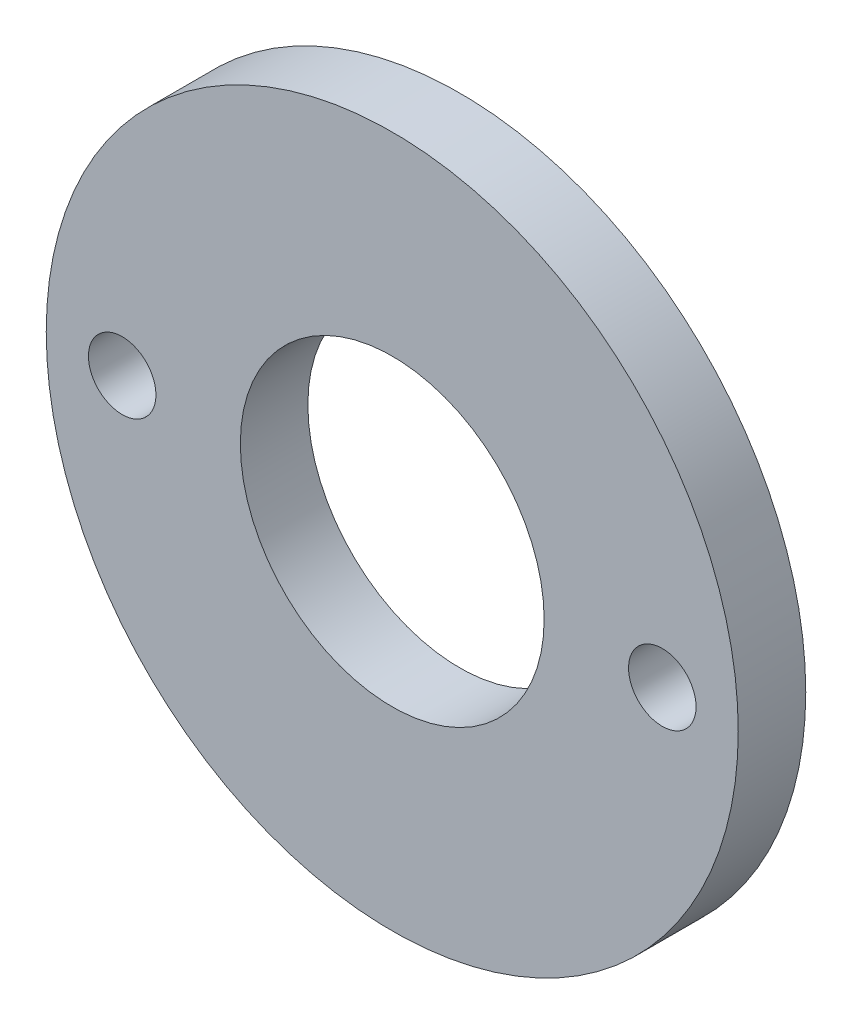
ISO-10303-21;
HEADER;
FILE_DESCRIPTION(('STEP AP214'),'2;1');
FILE_NAME('part.step','',(''),(''),'','','');
FILE_SCHEMA(('AUTOMOTIVE_DESIGN { 1 0 10303 214 1 1 1 1 }'));
ENDSEC;
DATA;
#1=APPLICATION_CONTEXT('core data for automotive mechanical design processes');
#2=APPLICATION_PROTOCOL_DEFINITION('international standard','automotive_design',2000,#1);
#3=PRODUCT_CONTEXT('',#1,'mechanical');
#4=PRODUCT('Part','Part','',(#3));
#5=PRODUCT_RELATED_PRODUCT_CATEGORY('part','',(#4));
#6=PRODUCT_DEFINITION_FORMATION('','',#4);
#7=PRODUCT_DEFINITION_CONTEXT('part definition',#1,'design');
#8=PRODUCT_DEFINITION('design','',#6,#7);
#9=PRODUCT_DEFINITION_SHAPE('','',#8);
#10=(LENGTH_UNIT() NAMED_UNIT(*) SI_UNIT(.MILLI.,.METRE.));
#11=(NAMED_UNIT(*) PLANE_ANGLE_UNIT() SI_UNIT($,.RADIAN.));
#12=(NAMED_UNIT(*) SI_UNIT($,.STERADIAN.) SOLID_ANGLE_UNIT());
#13=UNCERTAINTY_MEASURE_WITH_UNIT(LENGTH_MEASURE(1.E-05),#10,'distance_accuracy_value','');
#14=(GEOMETRIC_REPRESENTATION_CONTEXT(3) GLOBAL_UNCERTAINTY_ASSIGNED_CONTEXT((#13)) GLOBAL_UNIT_ASSIGNED_CONTEXT((#10,
#11,#12)) REPRESENTATION_CONTEXT('',''));
#15=CARTESIAN_POINT('',(0.,0.,0.));
#16=DIRECTION('',(0.,0.,1.));
#17=DIRECTION('',(1.,0.,0.));
#18=AXIS2_PLACEMENT_3D('',#15,#16,#17);
#19=CARTESIAN_POINT('',(0.,0.,2.));
#20=DIRECTION('',(0.,0.,1.));
#21=DIRECTION('',(1.,0.,0.));
#22=AXIS2_PLACEMENT_3D('',#19,#20,#21);
#23=PLANE('',#22);
#24=CARTESIAN_POINT('',(-8.,0.,2.));
#25=DIRECTION('',(0.,0.,1.));
#26=DIRECTION('',(1.,0.,0.));
#27=AXIS2_PLACEMENT_3D('',#24,#25,#26);
#28=CIRCLE('',#27,1.);
#29=CARTESIAN_POINT('',(-7.,0.,2.));
#30=VERTEX_POINT('',#29);
#31=EDGE_CURVE('E49',#30,#30,#28,.T.);
#32=ORIENTED_EDGE('',*,*,#31,.F.);
#33=EDGE_LOOP('',(#32));
#34=FACE_BOUND('',#33,.T.);
#35=CARTESIAN_POINT('',(0.,0.,2.));
#36=DIRECTION('',(0.,0.,1.));
#37=DIRECTION('',(1.,0.,0.));
#38=AXIS2_PLACEMENT_3D('',#35,#36,#37);
#39=CIRCLE('',#38,10.25);
#40=CARTESIAN_POINT('',(10.25,0.,2.));
#41=VERTEX_POINT('',#40);
#42=EDGE_CURVE('E10',#41,#41,#39,.T.);
#43=ORIENTED_EDGE('',*,*,#42,.T.);
#44=EDGE_LOOP('',(#43));
#45=FACE_BOUND('',#44,.T.);
#46=CARTESIAN_POINT('',(0.,0.,2.));
#47=DIRECTION('',(0.,0.,1.));
#48=DIRECTION('',(1.,0.,0.));
#49=AXIS2_PLACEMENT_3D('',#46,#47,#48);
#50=CIRCLE('',#49,4.5);
#51=CARTESIAN_POINT('',(4.5,0.,2.));
#52=VERTEX_POINT('',#51);
#53=EDGE_CURVE('E44',#52,#52,#50,.T.);
#54=ORIENTED_EDGE('',*,*,#53,.F.);
#55=EDGE_LOOP('',(#54));
#56=FACE_BOUND('',#55,.T.);
#57=CARTESIAN_POINT('',(8.,0.,2.));
#58=DIRECTION('',(0.,0.,1.));
#59=DIRECTION('',(1.,0.,0.));
#60=AXIS2_PLACEMENT_3D('',#57,#58,#59);
#61=CIRCLE('',#60,1.);
#62=CARTESIAN_POINT('',(9.,0.,2.));
#63=VERTEX_POINT('',#62);
#64=EDGE_CURVE('E55',#63,#63,#61,.T.);
#65=ORIENTED_EDGE('',*,*,#64,.F.);
#66=EDGE_LOOP('',(#65));
#67=FACE_BOUND('',#66,.T.);
#68=ADVANCED_FACE('F33',(#34,#45,#56,#67),#23,.T.);
#69=CARTESIAN_POINT('',(0.,0.,0.));
#70=DIRECTION('',(0.,0.,1.));
#71=DIRECTION('',(1.,0.,0.));
#72=AXIS2_PLACEMENT_3D('',#69,#70,#71);
#73=PLANE('',#72);
#74=CARTESIAN_POINT('',(0.,0.,0.));
#75=DIRECTION('',(0.,0.,1.));
#76=DIRECTION('',(1.,0.,0.));
#77=AXIS2_PLACEMENT_3D('',#74,#75,#76);
#78=CIRCLE('',#77,10.25);
#79=CARTESIAN_POINT('',(10.25,0.,0.));
#80=VERTEX_POINT('',#79);
#81=EDGE_CURVE('E37',#80,#80,#78,.T.);
#82=ORIENTED_EDGE('',*,*,#81,.F.);
#83=EDGE_LOOP('',(#82));
#84=FACE_BOUND('',#83,.T.);
#85=CARTESIAN_POINT('',(0.,0.,0.));
#86=DIRECTION('',(0.,0.,1.));
#87=DIRECTION('',(1.,0.,0.));
#88=AXIS2_PLACEMENT_3D('',#85,#86,#87);
#89=CIRCLE('',#88,4.5);
#90=CARTESIAN_POINT('',(4.5,0.,0.));
#91=VERTEX_POINT('',#90);
#92=EDGE_CURVE('E46',#91,#91,#89,.T.);
#93=ORIENTED_EDGE('',*,*,#92,.T.);
#94=EDGE_LOOP('',(#93));
#95=FACE_BOUND('',#94,.T.);
#96=CARTESIAN_POINT('',(-8.,0.,0.));
#97=DIRECTION('',(0.,0.,1.));
#98=DIRECTION('',(1.,0.,0.));
#99=AXIS2_PLACEMENT_3D('',#96,#97,#98);
#100=CIRCLE('',#99,1.);
#101=CARTESIAN_POINT('',(-7.,0.,0.));
#102=VERTEX_POINT('',#101);
#103=EDGE_CURVE('E52',#102,#102,#100,.T.);
#104=ORIENTED_EDGE('',*,*,#103,.T.);
#105=EDGE_LOOP('',(#104));
#106=FACE_BOUND('',#105,.T.);
#107=CARTESIAN_POINT('',(8.,0.,0.));
#108=DIRECTION('',(0.,0.,1.));
#109=DIRECTION('',(1.,0.,0.));
#110=AXIS2_PLACEMENT_3D('',#107,#108,#109);
#111=CIRCLE('',#110,1.);
#112=CARTESIAN_POINT('',(9.,0.,0.));
#113=VERTEX_POINT('',#112);
#114=EDGE_CURVE('E58',#113,#113,#111,.T.);
#115=ORIENTED_EDGE('',*,*,#114,.T.);
#116=EDGE_LOOP('',(#115));
#117=FACE_BOUND('',#116,.T.);
#118=ADVANCED_FACE('F68',(#84,#95,#106,#117),#73,.F.);
#119=CARTESIAN_POINT('',(0.,0.,2.));
#120=DIRECTION('',(0.,0.,-1.));
#121=DIRECTION('',(-1.,0.,0.));
#122=AXIS2_PLACEMENT_3D('',#119,#120,#121);
#123=CYLINDRICAL_SURFACE('',#122,10.25);
#124=ORIENTED_EDGE('',*,*,#42,.F.);
#125=EDGE_LOOP('',(#124));
#126=FACE_BOUND('',#125,.T.);
#127=ORIENTED_EDGE('',*,*,#81,.T.);
#128=EDGE_LOOP('',(#127));
#129=FACE_BOUND('',#128,.T.);
#130=ADVANCED_FACE('F35',(#126,#129),#123,.T.);
#131=CARTESIAN_POINT('',(0.,0.,2.));
#132=DIRECTION('',(0.,0.,-1.));
#133=DIRECTION('',(-1.,0.,0.));
#134=AXIS2_PLACEMENT_3D('',#131,#132,#133);
#135=CYLINDRICAL_SURFACE('',#134,4.5);
#136=ORIENTED_EDGE('',*,*,#53,.T.);
#137=EDGE_LOOP('',(#136));
#138=FACE_BOUND('',#137,.T.);
#139=ORIENTED_EDGE('',*,*,#92,.F.);
#140=EDGE_LOOP('',(#139));
#141=FACE_BOUND('',#140,.T.);
#142=ADVANCED_FACE('F77',(#138,#141),#135,.F.);
#143=CARTESIAN_POINT('',(-8.,0.,2.));
#144=DIRECTION('',(0.,0.,-1.));
#145=DIRECTION('',(-1.,0.,0.));
#146=AXIS2_PLACEMENT_3D('',#143,#144,#145);
#147=CYLINDRICAL_SURFACE('',#146,1.);
#148=ORIENTED_EDGE('',*,*,#31,.T.);
#149=EDGE_LOOP('',(#148));
#150=FACE_BOUND('',#149,.T.);
#151=ORIENTED_EDGE('',*,*,#103,.F.);
#152=EDGE_LOOP('',(#151));
#153=FACE_BOUND('',#152,.T.);
#154=ADVANCED_FACE('F80',(#150,#153),#147,.F.);
#155=CARTESIAN_POINT('',(8.,0.,2.));
#156=DIRECTION('',(0.,0.,-1.));
#157=DIRECTION('',(-1.,0.,0.));
#158=AXIS2_PLACEMENT_3D('',#155,#156,#157);
#159=CYLINDRICAL_SURFACE('',#158,1.);
#160=ORIENTED_EDGE('',*,*,#64,.T.);
#161=EDGE_LOOP('',(#160));
#162=FACE_BOUND('',#161,.T.);
#163=ORIENTED_EDGE('',*,*,#114,.F.);
#164=EDGE_LOOP('',(#163));
#165=FACE_BOUND('',#164,.T.);
#166=ADVANCED_FACE('F64',(#162,#165),#159,.F.);
#167=CLOSED_SHELL('',(#68,#118,#130,#142,#154,#166));
#168=MANIFOLD_SOLID_BREP('B2',#167);
#169=ADVANCED_BREP_SHAPE_REPRESENTATION('',(#18,#168),#14);
#170=SHAPE_DEFINITION_REPRESENTATION(#9,#169);
ENDSEC;
END-ISO-10303-21;
